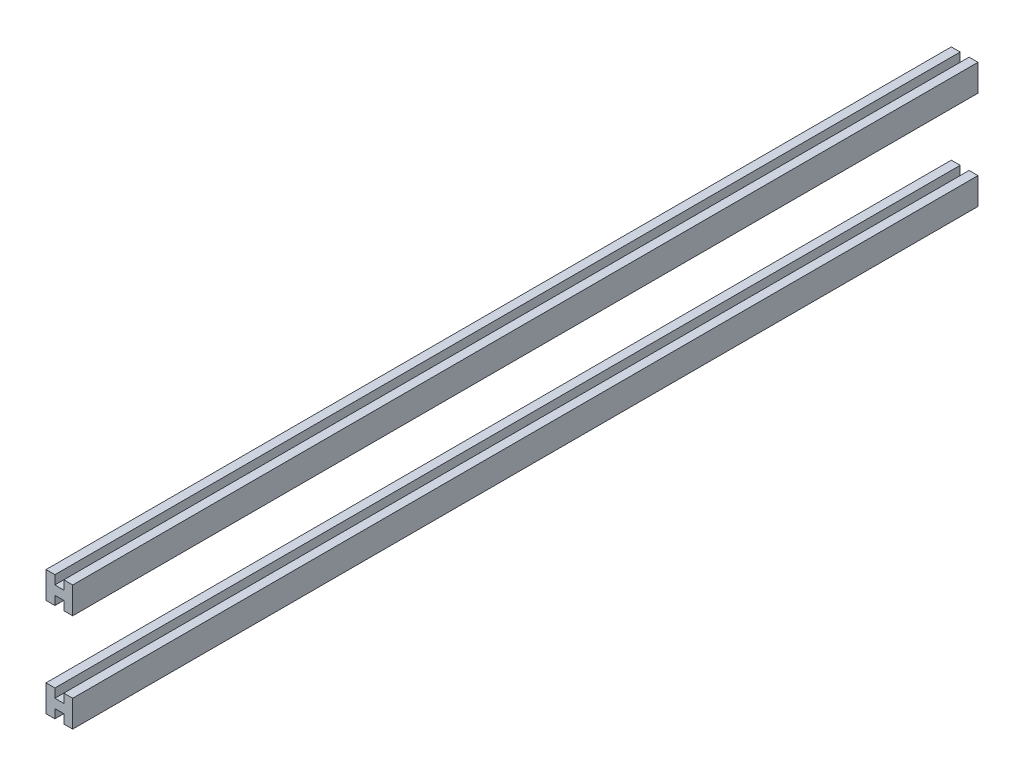
ISO-10303-21;
HEADER;
FILE_DESCRIPTION(('STEP AP214'),'2;1');
FILE_NAME('part.step','',(''),(''),'','','');
FILE_SCHEMA(('AUTOMOTIVE_DESIGN { 1 0 10303 214 1 1 1 1 }'));
ENDSEC;
DATA;
#1=APPLICATION_CONTEXT('core data for automotive mechanical design processes');
#2=APPLICATION_PROTOCOL_DEFINITION('international standard','automotive_design',2000,#1);
#3=PRODUCT_CONTEXT('',#1,'mechanical');
#4=PRODUCT('Part','Part','',(#3));
#5=PRODUCT_RELATED_PRODUCT_CATEGORY('part','',(#4));
#6=PRODUCT_DEFINITION_FORMATION('','',#4);
#7=PRODUCT_DEFINITION_CONTEXT('part definition',#1,'design');
#8=PRODUCT_DEFINITION('design','',#6,#7);
#9=PRODUCT_DEFINITION_SHAPE('','',#8);
#10=(LENGTH_UNIT() NAMED_UNIT(*) SI_UNIT(.MILLI.,.METRE.));
#11=(NAMED_UNIT(*) PLANE_ANGLE_UNIT() SI_UNIT($,.RADIAN.));
#12=(NAMED_UNIT(*) SI_UNIT($,.STERADIAN.) SOLID_ANGLE_UNIT());
#13=UNCERTAINTY_MEASURE_WITH_UNIT(LENGTH_MEASURE(1.E-05),#10,'distance_accuracy_value','');
#14=(GEOMETRIC_REPRESENTATION_CONTEXT(3) GLOBAL_UNCERTAINTY_ASSIGNED_CONTEXT((#13)) GLOBAL_UNIT_ASSIGNED_CONTEXT((#10,
#11,#12)) REPRESENTATION_CONTEXT('',''));
#15=CARTESIAN_POINT('',(0.,0.,0.));
#16=DIRECTION('',(0.,0.,1.));
#17=DIRECTION('',(1.,0.,0.));
#18=AXIS2_PLACEMENT_3D('',#15,#16,#17);
#19=CARTESIAN_POINT('',(368.783100920621,83.4055956434929,2578.1));
#20=DIRECTION('',(1.,0.,0.));
#21=DIRECTION('',(0.,1.,0.));
#22=AXIS2_PLACEMENT_3D('',#19,#20,#21);
#23=PLANE('',#22);
#24=DIRECTION('',(0.,-1.,0.));
#25=VECTOR('',#24,1.);
#26=CARTESIAN_POINT('',(368.783100920621,83.4055956434929,0.));
#27=LINE('',#26,#25);
#28=CARTESIAN_POINT('',(368.783100920621,83.4055956434929,0.));
#29=VERTEX_POINT('',#28);
#30=CARTESIAN_POINT('',(368.783100920621,58.0256924975783,0.));
#31=VERTEX_POINT('',#30);
#32=EDGE_CURVE('E12',#29,#31,#27,.T.);
#33=ORIENTED_EDGE('',*,*,#32,.F.);
#34=DIRECTION('',(0.,0.,-1.));
#35=VECTOR('',#34,1.);
#36=CARTESIAN_POINT('',(368.783100920621,83.4055956434929,2578.1));
#37=LINE('',#36,#35);
#38=CARTESIAN_POINT('',(368.783100920621,83.4055956434929,2578.1));
#39=VERTEX_POINT('',#38);
#40=EDGE_CURVE('E115',#39,#29,#37,.T.);
#41=ORIENTED_EDGE('',*,*,#40,.F.);
#42=DIRECTION('',(0.,-1.,0.));
#43=VECTOR('',#42,1.);
#44=CARTESIAN_POINT('',(368.783100920621,83.4055956434929,2578.1));
#45=LINE('',#44,#43);
#46=CARTESIAN_POINT('',(368.783100920621,58.0256924975783,2578.1));
#47=VERTEX_POINT('',#46);
#48=EDGE_CURVE('E47',#39,#47,#45,.T.);
#49=ORIENTED_EDGE('',*,*,#48,.T.);
#50=DIRECTION('',(0.,0.,-1.));
#51=VECTOR('',#50,1.);
#52=CARTESIAN_POINT('',(368.783100920621,58.0256924975783,2578.1));
#53=LINE('',#52,#51);
#54=EDGE_CURVE('E62',#47,#31,#53,.T.);
#55=ORIENTED_EDGE('',*,*,#54,.T.);
#56=EDGE_LOOP('',(#33,#41,#49,#55));
#57=FACE_BOUND('',#56,.T.);
#58=ADVANCED_FACE('F43',(#57),#23,.T.);
#59=CARTESIAN_POINT('',(368.783100920621,83.4055956434929,2578.1));
#60=DIRECTION('',(0.,-1.,0.));
#61=DIRECTION('',(1.,0.,0.));
#62=AXIS2_PLACEMENT_3D('',#59,#60,#61);
#63=PLANE('',#62);
#64=DIRECTION('',(-1.,0.,0.));
#65=VECTOR('',#64,1.);
#66=CARTESIAN_POINT('',(368.783100920621,83.4055956434929,0.));
#67=LINE('',#66,#65);
#68=CARTESIAN_POINT('',(343.471899041142,83.4055956434928,0.));
#69=VERTEX_POINT('',#68);
#70=EDGE_CURVE('E190',#29,#69,#67,.T.);
#71=ORIENTED_EDGE('',*,*,#70,.T.);
#72=DIRECTION('',(0.,0.,-1.));
#73=VECTOR('',#72,1.);
#74=CARTESIAN_POINT('',(343.471899041142,83.4055956434928,2578.1));
#75=LINE('',#74,#73);
#76=CARTESIAN_POINT('',(343.471899041142,83.4055956434928,2578.1));
#77=VERTEX_POINT('',#76);
#78=EDGE_CURVE('E247',#77,#69,#75,.T.);
#79=ORIENTED_EDGE('',*,*,#78,.F.);
#80=DIRECTION('',(-1.,0.,0.));
#81=VECTOR('',#80,1.);
#82=CARTESIAN_POINT('',(368.783100920621,83.4055956434929,2578.1));
#83=LINE('',#82,#81);
#84=EDGE_CURVE('E167',#39,#77,#83,.T.);
#85=ORIENTED_EDGE('',*,*,#84,.F.);
#86=ORIENTED_EDGE('',*,*,#40,.T.);
#87=EDGE_LOOP('',(#71,#79,#85,#86));
#88=FACE_BOUND('',#87,.T.);
#89=ADVANCED_FACE('F256',(#88),#63,.F.);
#90=CARTESIAN_POINT('',(343.471899041142,83.4055956434928,2578.1));
#91=DIRECTION('',(1.,0.,0.));
#92=DIRECTION('',(0.,1.,0.));
#93=AXIS2_PLACEMENT_3D('',#90,#91,#92);
#94=PLANE('',#93);
#95=DIRECTION('',(0.,-1.,0.));
#96=VECTOR('',#95,1.);
#97=CARTESIAN_POINT('',(343.471899041142,83.4055956434928,0.));
#98=LINE('',#97,#96);
#99=CARTESIAN_POINT('',(343.471899041142,7.20559564349288,0.));
#100=VERTEX_POINT('',#99);
#101=EDGE_CURVE('E191',#69,#100,#98,.T.);
#102=ORIENTED_EDGE('',*,*,#101,.T.);
#103=DIRECTION('',(0.,0.,-1.));
#104=VECTOR('',#103,1.);
#105=CARTESIAN_POINT('',(343.471899041142,7.20559564349288,2578.1));
#106=LINE('',#105,#104);
#107=CARTESIAN_POINT('',(343.471899041142,7.20559564349288,2578.1));
#108=VERTEX_POINT('',#107);
#109=EDGE_CURVE('E245',#108,#100,#106,.T.);
#110=ORIENTED_EDGE('',*,*,#109,.F.);
#111=DIRECTION('',(0.,-1.,0.));
#112=VECTOR('',#111,1.);
#113=CARTESIAN_POINT('',(343.471899041142,83.4055956434928,2578.1));
#114=LINE('',#113,#112);
#115=EDGE_CURVE('E169',#77,#108,#114,.T.);
#116=ORIENTED_EDGE('',*,*,#115,.F.);
#117=ORIENTED_EDGE('',*,*,#78,.T.);
#118=EDGE_LOOP('',(#102,#110,#116,#117));
#119=FACE_BOUND('',#118,.T.);
#120=ADVANCED_FACE('F253',(#119),#94,.F.);
#121=CARTESIAN_POINT('',(368.783100920621,7.20559564349288,2578.1));
#122=DIRECTION('',(0.,-1.,0.));
#123=DIRECTION('',(0.,0.,-1.));
#124=AXIS2_PLACEMENT_3D('',#121,#122,#123);
#125=PLANE('',#124);
#126=DIRECTION('',(-1.,0.,0.));
#127=VECTOR('',#126,1.);
#128=CARTESIAN_POINT('',(368.783100920621,7.20559564349288,0.));
#129=LINE('',#128,#127);
#130=CARTESIAN_POINT('',(368.783100920621,7.20559564349288,0.));
#131=VERTEX_POINT('',#130);
#132=EDGE_CURVE('E196',#131,#100,#129,.T.);
#133=ORIENTED_EDGE('',*,*,#132,.F.);
#134=DIRECTION('',(0.,0.,-1.));
#135=VECTOR('',#134,1.);
#136=CARTESIAN_POINT('',(368.783100920621,7.20559564349288,2578.1));
#137=LINE('',#136,#135);
#138=CARTESIAN_POINT('',(368.783100920621,7.20559564349288,2578.1));
#139=VERTEX_POINT('',#138);
#140=EDGE_CURVE('E240',#139,#131,#137,.T.);
#141=ORIENTED_EDGE('',*,*,#140,.F.);
#142=DIRECTION('',(-1.,0.,0.));
#143=VECTOR('',#142,1.);
#144=CARTESIAN_POINT('',(368.783100920621,7.20559564349288,2578.1));
#145=LINE('',#144,#143);
#146=EDGE_CURVE('E171',#139,#108,#145,.T.);
#147=ORIENTED_EDGE('',*,*,#146,.T.);
#148=ORIENTED_EDGE('',*,*,#109,.T.);
#149=EDGE_LOOP('',(#133,#141,#147,#148));
#150=FACE_BOUND('',#149,.T.);
#151=ADVANCED_FACE('F255',(#150),#125,.T.);
#152=CARTESIAN_POINT('',(368.783100920621,7.20559564349288,2578.1));
#153=DIRECTION('',(-1.,0.,0.));
#154=DIRECTION('',(0.,0.,1.));
#155=AXIS2_PLACEMENT_3D('',#152,#153,#154);
#156=PLANE('',#155);
#157=DIRECTION('',(0.,1.,0.));
#158=VECTOR('',#157,1.);
#159=CARTESIAN_POINT('',(368.783100920621,7.20559564349288,0.));
#160=LINE('',#159,#158);
#161=CARTESIAN_POINT('',(368.783100920621,32.5854987894074,0.));
#162=VERTEX_POINT('',#161);
#163=EDGE_CURVE('E203',#131,#162,#160,.T.);
#164=ORIENTED_EDGE('',*,*,#163,.T.);
#165=DIRECTION('',(0.,0.,-1.));
#166=VECTOR('',#165,1.);
#167=CARTESIAN_POINT('',(368.783100920621,32.5854987894074,2578.1));
#168=LINE('',#167,#166);
#169=CARTESIAN_POINT('',(368.783100920621,32.5854987894074,2578.1));
#170=VERTEX_POINT('',#169);
#171=EDGE_CURVE('E237',#170,#162,#168,.T.);
#172=ORIENTED_EDGE('',*,*,#171,.F.);
#173=DIRECTION('',(0.,1.,0.));
#174=VECTOR('',#173,1.);
#175=CARTESIAN_POINT('',(368.783100920621,7.20559564349288,2578.1));
#176=LINE('',#175,#174);
#177=EDGE_CURVE('E174',#139,#170,#176,.T.);
#178=ORIENTED_EDGE('',*,*,#177,.F.);
#179=ORIENTED_EDGE('',*,*,#140,.T.);
#180=EDGE_LOOP('',(#164,#172,#178,#179));
#181=FACE_BOUND('',#180,.T.);
#182=ADVANCED_FACE('F242',(#181),#156,.F.);
#183=CARTESIAN_POINT('',(394.183100920621,32.5854987894074,2578.1));
#184=DIRECTION('',(0.,-1.,0.));
#185=DIRECTION('',(0.,0.,-1.));
#186=AXIS2_PLACEMENT_3D('',#183,#184,#185);
#187=PLANE('',#186);
#188=DIRECTION('',(-1.,0.,0.));
#189=VECTOR('',#188,1.);
#190=CARTESIAN_POINT('',(394.183100920621,32.5854987894074,0.));
#191=LINE('',#190,#189);
#192=CARTESIAN_POINT('',(394.183100920621,32.5854987894074,0.));
#193=VERTEX_POINT('',#192);
#194=EDGE_CURVE('E206',#193,#162,#191,.T.);
#195=ORIENTED_EDGE('',*,*,#194,.F.);
#196=DIRECTION('',(0.,0.,-1.));
#197=VECTOR('',#196,1.);
#198=CARTESIAN_POINT('',(394.183100920621,32.5854987894074,2578.1));
#199=LINE('',#198,#197);
#200=CARTESIAN_POINT('',(394.183100920621,32.5854987894074,2578.1));
#201=VERTEX_POINT('',#200);
#202=EDGE_CURVE('E227',#201,#193,#199,.T.);
#203=ORIENTED_EDGE('',*,*,#202,.F.);
#204=DIRECTION('',(-1.,0.,0.));
#205=VECTOR('',#204,1.);
#206=CARTESIAN_POINT('',(394.183100920621,32.5854987894074,2578.1));
#207=LINE('',#206,#205);
#208=EDGE_CURVE('E176',#201,#170,#207,.T.);
#209=ORIENTED_EDGE('',*,*,#208,.T.);
#210=ORIENTED_EDGE('',*,*,#171,.T.);
#211=EDGE_LOOP('',(#195,#203,#209,#210));
#212=FACE_BOUND('',#211,.T.);
#213=ADVANCED_FACE('F234',(#212),#187,.T.);
#214=CARTESIAN_POINT('',(394.183100920621,7.20559564349288,2578.1));
#215=DIRECTION('',(-1.,0.,0.));
#216=DIRECTION('',(0.,0.,1.));
#217=AXIS2_PLACEMENT_3D('',#214,#215,#216);
#218=PLANE('',#217);
#219=DIRECTION('',(0.,1.,0.));
#220=VECTOR('',#219,1.);
#221=CARTESIAN_POINT('',(394.183100920621,7.20559564349288,0.));
#222=LINE('',#221,#220);
#223=CARTESIAN_POINT('',(394.183100920621,7.20559564349288,0.));
#224=VERTEX_POINT('',#223);
#225=EDGE_CURVE('E209',#224,#193,#222,.T.);
#226=ORIENTED_EDGE('',*,*,#225,.F.);
#227=DIRECTION('',(0.,0.,-1.));
#228=VECTOR('',#227,1.);
#229=CARTESIAN_POINT('',(394.183100920621,7.20559564349288,2578.1));
#230=LINE('',#229,#228);
#231=CARTESIAN_POINT('',(394.183100920621,7.20559564349288,2578.1));
#232=VERTEX_POINT('',#231);
#233=EDGE_CURVE('E221',#232,#224,#230,.T.);
#234=ORIENTED_EDGE('',*,*,#233,.F.);
#235=DIRECTION('',(0.,1.,0.));
#236=VECTOR('',#235,1.);
#237=CARTESIAN_POINT('',(394.183100920621,7.20559564349288,2578.1));
#238=LINE('',#237,#236);
#239=EDGE_CURVE('E179',#232,#201,#238,.T.);
#240=ORIENTED_EDGE('',*,*,#239,.T.);
#241=ORIENTED_EDGE('',*,*,#202,.T.);
#242=EDGE_LOOP('',(#226,#234,#240,#241));
#243=FACE_BOUND('',#242,.T.);
#244=ADVANCED_FACE('F229',(#243),#218,.T.);
#245=CARTESIAN_POINT('',(419.4943028001,7.20559564349288,2578.1));
#246=DIRECTION('',(0.,-1.,0.));
#247=DIRECTION('',(0.,0.,-1.));
#248=AXIS2_PLACEMENT_3D('',#245,#246,#247);
#249=PLANE('',#248);
#250=DIRECTION('',(-1.,0.,0.));
#251=VECTOR('',#250,1.);
#252=CARTESIAN_POINT('',(419.4943028001,7.20559564349288,0.));
#253=LINE('',#252,#251);
#254=CARTESIAN_POINT('',(419.4943028001,7.20559564349288,0.));
#255=VERTEX_POINT('',#254);
#256=EDGE_CURVE('E212',#255,#224,#253,.T.);
#257=ORIENTED_EDGE('',*,*,#256,.F.);
#258=DIRECTION('',(0.,0.,-1.));
#259=VECTOR('',#258,1.);
#260=CARTESIAN_POINT('',(419.4943028001,7.20559564349288,2578.1));
#261=LINE('',#260,#259);
#262=CARTESIAN_POINT('',(419.4943028001,7.20559564349288,2578.1));
#263=VERTEX_POINT('',#262);
#264=EDGE_CURVE('E217',#263,#255,#261,.T.);
#265=ORIENTED_EDGE('',*,*,#264,.F.);
#266=DIRECTION('',(-1.,0.,0.));
#267=VECTOR('',#266,1.);
#268=CARTESIAN_POINT('',(419.4943028001,7.20559564349288,2578.1));
#269=LINE('',#268,#267);
#270=EDGE_CURVE('E182',#263,#232,#269,.T.);
#271=ORIENTED_EDGE('',*,*,#270,.T.);
#272=ORIENTED_EDGE('',*,*,#233,.T.);
#273=EDGE_LOOP('',(#257,#265,#271,#272));
#274=FACE_BOUND('',#273,.T.);
#275=ADVANCED_FACE('F223',(#274),#249,.T.);
#276=CARTESIAN_POINT('',(419.4943028001,83.4055956434928,2578.1));
#277=DIRECTION('',(1.,0.,0.));
#278=DIRECTION('',(0.,0.,-1.));
#279=AXIS2_PLACEMENT_3D('',#276,#277,#278);
#280=PLANE('',#279);
#281=DIRECTION('',(0.,-1.,0.));
#282=VECTOR('',#281,1.);
#283=CARTESIAN_POINT('',(419.4943028001,83.4055956434928,0.));
#284=LINE('',#283,#282);
#285=CARTESIAN_POINT('',(419.4943028001,83.4055956434928,0.));
#286=VERTEX_POINT('',#285);
#287=EDGE_CURVE('E154',#286,#255,#284,.T.);
#288=ORIENTED_EDGE('',*,*,#287,.F.);
#289=DIRECTION('',(0.,0.,-1.));
#290=VECTOR('',#289,1.);
#291=CARTESIAN_POINT('',(419.4943028001,83.4055956434928,2578.1));
#292=LINE('',#291,#290);
#293=CARTESIAN_POINT('',(419.4943028001,83.4055956434928,2578.1));
#294=VERTEX_POINT('',#293);
#295=EDGE_CURVE('E148',#294,#286,#292,.T.);
#296=ORIENTED_EDGE('',*,*,#295,.F.);
#297=DIRECTION('',(0.,-1.,0.));
#298=VECTOR('',#297,1.);
#299=CARTESIAN_POINT('',(419.4943028001,83.4055956434928,2578.1));
#300=LINE('',#299,#298);
#301=EDGE_CURVE('E185',#294,#263,#300,.T.);
#302=ORIENTED_EDGE('',*,*,#301,.T.);
#303=ORIENTED_EDGE('',*,*,#264,.T.);
#304=EDGE_LOOP('',(#288,#296,#302,#303));
#305=FACE_BOUND('',#304,.T.);
#306=ADVANCED_FACE('F216',(#305),#280,.T.);
#307=CARTESIAN_POINT('',(419.4943028001,83.4055956434928,2578.1));
#308=DIRECTION('',(0.,-1.,0.));
#309=DIRECTION('',(0.,0.,-1.));
#310=AXIS2_PLACEMENT_3D('',#307,#308,#309);
#311=PLANE('',#310);
#312=DIRECTION('',(-1.,0.,0.));
#313=VECTOR('',#312,1.);
#314=CARTESIAN_POINT('',(419.4943028001,83.4055956434928,0.));
#315=LINE('',#314,#313);
#316=CARTESIAN_POINT('',(394.183100920621,83.4055956434928,0.));
#317=VERTEX_POINT('',#316);
#318=EDGE_CURVE('E143',#286,#317,#315,.T.);
#319=ORIENTED_EDGE('',*,*,#318,.T.);
#320=DIRECTION('',(0.,0.,-1.));
#321=VECTOR('',#320,1.);
#322=CARTESIAN_POINT('',(394.183100920621,83.4055956434928,2578.1));
#323=LINE('',#322,#321);
#324=CARTESIAN_POINT('',(394.183100920621,83.4055956434928,2578.1));
#325=VERTEX_POINT('',#324);
#326=EDGE_CURVE('E147',#325,#317,#323,.T.);
#327=ORIENTED_EDGE('',*,*,#326,.F.);
#328=DIRECTION('',(-1.,0.,0.));
#329=VECTOR('',#328,1.);
#330=CARTESIAN_POINT('',(419.4943028001,83.4055956434928,2578.1));
#331=LINE('',#330,#329);
#332=EDGE_CURVE('E188',#294,#325,#331,.T.);
#333=ORIENTED_EDGE('',*,*,#332,.F.);
#334=ORIENTED_EDGE('',*,*,#295,.T.);
#335=EDGE_LOOP('',(#319,#327,#333,#334));
#336=FACE_BOUND('',#335,.T.);
#337=ADVANCED_FACE('F145',(#336),#311,.F.);
#338=CARTESIAN_POINT('',(394.183100920621,83.4055956434928,2578.1));
#339=DIRECTION('',(1.,0.,0.));
#340=DIRECTION('',(0.,0.,-1.));
#341=AXIS2_PLACEMENT_3D('',#338,#339,#340);
#342=PLANE('',#341);
#343=DIRECTION('',(0.,-1.,0.));
#344=VECTOR('',#343,1.);
#345=CARTESIAN_POINT('',(394.183100920621,83.4055956434928,0.));
#346=LINE('',#345,#344);
#347=CARTESIAN_POINT('',(394.183100920621,58.0256924975783,0.));
#348=VERTEX_POINT('',#347);
#349=EDGE_CURVE('E153',#317,#348,#346,.T.);
#350=ORIENTED_EDGE('',*,*,#349,.T.);
#351=DIRECTION('',(0.,0.,-1.));
#352=VECTOR('',#351,1.);
#353=CARTESIAN_POINT('',(394.183100920621,58.0256924975783,2578.1));
#354=LINE('',#353,#352);
#355=CARTESIAN_POINT('',(394.183100920621,58.0256924975783,2578.1));
#356=VERTEX_POINT('',#355);
#357=EDGE_CURVE('E159',#356,#348,#354,.T.);
#358=ORIENTED_EDGE('',*,*,#357,.F.);
#359=DIRECTION('',(0.,-1.,0.));
#360=VECTOR('',#359,1.);
#361=CARTESIAN_POINT('',(394.183100920621,83.4055956434928,2578.1));
#362=LINE('',#361,#360);
#363=EDGE_CURVE('E103',#325,#356,#362,.T.);
#364=ORIENTED_EDGE('',*,*,#363,.F.);
#365=ORIENTED_EDGE('',*,*,#326,.T.);
#366=EDGE_LOOP('',(#350,#358,#364,#365));
#367=FACE_BOUND('',#366,.T.);
#368=ADVANCED_FACE('F157',(#367),#342,.F.);
#369=CARTESIAN_POINT('',(394.183100920621,58.0256924975783,2578.1));
#370=DIRECTION('',(0.,-1.,0.));
#371=DIRECTION('',(1.,0.,0.));
#372=AXIS2_PLACEMENT_3D('',#369,#370,#371);
#373=PLANE('',#372);
#374=DIRECTION('',(-1.,0.,0.));
#375=VECTOR('',#374,1.);
#376=CARTESIAN_POINT('',(394.183100920621,58.0256924975783,0.));
#377=LINE('',#376,#375);
#378=EDGE_CURVE('E53',#348,#31,#377,.T.);
#379=ORIENTED_EDGE('',*,*,#378,.T.);
#380=ORIENTED_EDGE('',*,*,#54,.F.);
#381=DIRECTION('',(-1.,0.,0.));
#382=VECTOR('',#381,1.);
#383=CARTESIAN_POINT('',(394.183100920621,58.0256924975783,2578.1));
#384=LINE('',#383,#382);
#385=EDGE_CURVE('E108',#356,#47,#384,.T.);
#386=ORIENTED_EDGE('',*,*,#385,.F.);
#387=ORIENTED_EDGE('',*,*,#357,.T.);
#388=EDGE_LOOP('',(#379,#380,#386,#387));
#389=FACE_BOUND('',#388,.T.);
#390=ADVANCED_FACE('F270',(#389),#373,.F.);
#391=CARTESIAN_POINT('',(0.,0.,2578.1));
#392=DIRECTION('',(0.,0.,-1.));
#393=DIRECTION('',(-1.,0.,0.));
#394=AXIS2_PLACEMENT_3D('',#391,#392,#393);
#395=PLANE('',#394);
#396=ORIENTED_EDGE('',*,*,#48,.F.);
#397=ORIENTED_EDGE('',*,*,#84,.T.);
#398=ORIENTED_EDGE('',*,*,#115,.T.);
#399=ORIENTED_EDGE('',*,*,#146,.F.);
#400=ORIENTED_EDGE('',*,*,#177,.T.);
#401=ORIENTED_EDGE('',*,*,#208,.F.);
#402=ORIENTED_EDGE('',*,*,#239,.F.);
#403=ORIENTED_EDGE('',*,*,#270,.F.);
#404=ORIENTED_EDGE('',*,*,#301,.F.);
#405=ORIENTED_EDGE('',*,*,#332,.T.);
#406=ORIENTED_EDGE('',*,*,#363,.T.);
#407=ORIENTED_EDGE('',*,*,#385,.T.);
#408=EDGE_LOOP('',(#396,#397,#398,#399,#400,#401,#402,#403,#404,#405,#406,#407));
#409=FACE_BOUND('',#408,.T.);
#410=ADVANCED_FACE('F45',(#409),#395,.F.);
#411=CARTESIAN_POINT('',(0.,0.,0.));
#412=DIRECTION('',(0.,0.,-1.));
#413=DIRECTION('',(-1.,0.,0.));
#414=AXIS2_PLACEMENT_3D('',#411,#412,#413);
#415=PLANE('',#414);
#416=ORIENTED_EDGE('',*,*,#32,.T.);
#417=ORIENTED_EDGE('',*,*,#378,.F.);
#418=ORIENTED_EDGE('',*,*,#349,.F.);
#419=ORIENTED_EDGE('',*,*,#318,.F.);
#420=ORIENTED_EDGE('',*,*,#287,.T.);
#421=ORIENTED_EDGE('',*,*,#256,.T.);
#422=ORIENTED_EDGE('',*,*,#225,.T.);
#423=ORIENTED_EDGE('',*,*,#194,.T.);
#424=ORIENTED_EDGE('',*,*,#163,.F.);
#425=ORIENTED_EDGE('',*,*,#132,.T.);
#426=ORIENTED_EDGE('',*,*,#101,.F.);
#427=ORIENTED_EDGE('',*,*,#70,.F.);
#428=EDGE_LOOP('',(#416,#417,#418,#419,#420,#421,#422,#423,#424,#425,#426,#427));
#429=FACE_BOUND('',#428,.T.);
#430=ADVANCED_FACE('F162',(#429),#415,.T.);
#431=CLOSED_SHELL('',(#58,#89,#120,#151,#182,#213,#244,#275,#306,#337,#368,#390,#410,#430));
#432=MANIFOLD_SOLID_BREP('B2',#431);
#433=CARTESIAN_POINT('',(368.783100920621,-272.194404356507,2578.1));
#434=DIRECTION('',(0.,-1.,0.));
#435=DIRECTION('',(1.,0.,0.));
#436=AXIS2_PLACEMENT_3D('',#433,#434,#435);
#437=PLANE('',#436);
#438=DIRECTION('',(-1.,0.,0.));
#439=VECTOR('',#438,1.);
#440=CARTESIAN_POINT('',(368.783100920621,-272.194404356507,0.));
#441=LINE('',#440,#439);
#442=CARTESIAN_POINT('',(368.783100920621,-272.194404356507,0.));
#443=VERTEX_POINT('',#442);
#444=CARTESIAN_POINT('',(343.471899041142,-272.194404356507,0.));
#445=VERTEX_POINT('',#444);
#446=EDGE_CURVE('E497',#443,#445,#441,.T.);
#447=ORIENTED_EDGE('',*,*,#446,.F.);
#448=DIRECTION('',(0.,0.,-1.));
#449=VECTOR('',#448,1.);
#450=CARTESIAN_POINT('',(368.783100920621,-272.194404356507,2578.1));
#451=LINE('',#450,#449);
#452=CARTESIAN_POINT('',(368.783100920621,-272.194404356507,2578.1));
#453=VERTEX_POINT('',#452);
#454=EDGE_CURVE('E41',#453,#443,#451,.T.);
#455=ORIENTED_EDGE('',*,*,#454,.F.);
#456=DIRECTION('',(-1.,0.,0.));
#457=VECTOR('',#456,1.);
#458=CARTESIAN_POINT('',(368.783100920621,-272.194404356507,2578.1));
#459=LINE('',#458,#457);
#460=CARTESIAN_POINT('',(343.471899041142,-272.194404356507,2578.1));
#461=VERTEX_POINT('',#460);
#462=EDGE_CURVE('E525',#453,#461,#459,.T.);
#463=ORIENTED_EDGE('',*,*,#462,.T.);
#464=DIRECTION('',(0.,0.,-1.));
#465=VECTOR('',#464,1.);
#466=CARTESIAN_POINT('',(343.471899041142,-272.194404356507,2578.1));
#467=LINE('',#466,#465);
#468=EDGE_CURVE('E378',#461,#445,#467,.T.);
#469=ORIENTED_EDGE('',*,*,#468,.T.);
#470=EDGE_LOOP('',(#447,#455,#463,#469));
#471=FACE_BOUND('',#470,.T.);
#472=ADVANCED_FACE('F375',(#471),#437,.T.);
#473=CARTESIAN_POINT('',(368.783100920621,-272.194404356507,2578.1));
#474=DIRECTION('',(-1.,0.,0.));
#475=DIRECTION('',(0.,-1.,0.));
#476=AXIS2_PLACEMENT_3D('',#473,#474,#475);
#477=PLANE('',#476);
#478=DIRECTION('',(0.,1.,0.));
#479=VECTOR('',#478,1.);
#480=CARTESIAN_POINT('',(368.783100920621,-272.194404356507,0.));
#481=LINE('',#480,#479);
#482=CARTESIAN_POINT('',(368.783100920621,-246.814501210593,0.));
#483=VERTEX_POINT('',#482);
#484=EDGE_CURVE('E524',#443,#483,#481,.T.);
#485=ORIENTED_EDGE('',*,*,#484,.T.);
#486=DIRECTION('',(0.,0.,-1.));
#487=VECTOR('',#486,1.);
#488=CARTESIAN_POINT('',(368.783100920621,-246.814501210593,2578.1));
#489=LINE('',#488,#487);
#490=CARTESIAN_POINT('',(368.783100920621,-246.814501210593,2578.1));
#491=VERTEX_POINT('',#490);
#492=EDGE_CURVE('E384',#491,#483,#489,.T.);
#493=ORIENTED_EDGE('',*,*,#492,.F.);
#494=DIRECTION('',(0.,1.,0.));
#495=VECTOR('',#494,1.);
#496=CARTESIAN_POINT('',(368.783100920621,-272.194404356507,2578.1));
#497=LINE('',#496,#495);
#498=EDGE_CURVE('E487',#453,#491,#497,.T.);
#499=ORIENTED_EDGE('',*,*,#498,.F.);
#500=ORIENTED_EDGE('',*,*,#454,.T.);
#501=EDGE_LOOP('',(#485,#493,#499,#500));
#502=FACE_BOUND('',#501,.T.);
#503=ADVANCED_FACE('F549',(#502),#477,.F.);
#504=CARTESIAN_POINT('',(394.183100920621,-246.814501210593,2578.1));
#505=DIRECTION('',(0.,-1.,0.));
#506=DIRECTION('',(1.,0.,0.));
#507=AXIS2_PLACEMENT_3D('',#504,#505,#506);
#508=PLANE('',#507);
#509=DIRECTION('',(-1.,0.,0.));
#510=VECTOR('',#509,1.);
#511=CARTESIAN_POINT('',(394.183100920621,-246.814501210593,0.));
#512=LINE('',#511,#510);
#513=CARTESIAN_POINT('',(394.183100920621,-246.814501210593,0.));
#514=VERTEX_POINT('',#513);
#515=EDGE_CURVE('E473',#514,#483,#512,.T.);
#516=ORIENTED_EDGE('',*,*,#515,.F.);
#517=DIRECTION('',(0.,0.,-1.));
#518=VECTOR('',#517,1.);
#519=CARTESIAN_POINT('',(394.183100920621,-246.814501210593,2578.1));
#520=LINE('',#519,#518);
#521=CARTESIAN_POINT('',(394.183100920621,-246.814501210593,2578.1));
#522=VERTEX_POINT('',#521);
#523=EDGE_CURVE('E468',#522,#514,#520,.T.);
#524=ORIENTED_EDGE('',*,*,#523,.F.);
#525=DIRECTION('',(-1.,0.,0.));
#526=VECTOR('',#525,1.);
#527=CARTESIAN_POINT('',(394.183100920621,-246.814501210593,2578.1));
#528=LINE('',#527,#526);
#529=EDGE_CURVE('E471',#522,#491,#528,.T.);
#530=ORIENTED_EDGE('',*,*,#529,.T.);
#531=ORIENTED_EDGE('',*,*,#492,.T.);
#532=EDGE_LOOP('',(#516,#524,#530,#531));
#533=FACE_BOUND('',#532,.T.);
#534=ADVANCED_FACE('F470',(#533),#508,.T.);
#535=CARTESIAN_POINT('',(394.183100920621,-272.194404356507,2578.1));
#536=DIRECTION('',(-1.,0.,0.));
#537=DIRECTION('',(0.,0.,1.));
#538=AXIS2_PLACEMENT_3D('',#535,#536,#537);
#539=PLANE('',#538);
#540=DIRECTION('',(0.,1.,0.));
#541=VECTOR('',#540,1.);
#542=CARTESIAN_POINT('',(394.183100920621,-272.194404356507,0.));
#543=LINE('',#542,#541);
#544=CARTESIAN_POINT('',(394.183100920621,-272.194404356507,0.));
#545=VERTEX_POINT('',#544);
#546=EDGE_CURVE('E521',#545,#514,#543,.T.);
#547=ORIENTED_EDGE('',*,*,#546,.F.);
#548=DIRECTION('',(0.,0.,-1.));
#549=VECTOR('',#548,1.);
#550=CARTESIAN_POINT('',(394.183100920621,-272.194404356507,2578.1));
#551=LINE('',#550,#549);
#552=CARTESIAN_POINT('',(394.183100920621,-272.194404356507,2578.1));
#553=VERTEX_POINT('',#552);
#554=EDGE_CURVE('E478',#553,#545,#551,.T.);
#555=ORIENTED_EDGE('',*,*,#554,.F.);
#556=DIRECTION('',(0.,1.,0.));
#557=VECTOR('',#556,1.);
#558=CARTESIAN_POINT('',(394.183100920621,-272.194404356507,2578.1));
#559=LINE('',#558,#557);
#560=EDGE_CURVE('E485',#553,#522,#559,.T.);
#561=ORIENTED_EDGE('',*,*,#560,.T.);
#562=ORIENTED_EDGE('',*,*,#523,.T.);
#563=EDGE_LOOP('',(#547,#555,#561,#562));
#564=FACE_BOUND('',#563,.T.);
#565=ADVANCED_FACE('F489',(#564),#539,.T.);
#566=CARTESIAN_POINT('',(419.4943028001,-272.194404356507,2578.1));
#567=DIRECTION('',(0.,-1.,0.));
#568=DIRECTION('',(0.,0.,-1.));
#569=AXIS2_PLACEMENT_3D('',#566,#567,#568);
#570=PLANE('',#569);
#571=DIRECTION('',(-1.,0.,0.));
#572=VECTOR('',#571,1.);
#573=CARTESIAN_POINT('',(419.4943028001,-272.194404356507,0.));
#574=LINE('',#573,#572);
#575=CARTESIAN_POINT('',(419.4943028001,-272.194404356507,0.));
#576=VERTEX_POINT('',#575);
#577=EDGE_CURVE('E518',#576,#545,#574,.T.);
#578=ORIENTED_EDGE('',*,*,#577,.F.);
#579=DIRECTION('',(0.,0.,-1.));
#580=VECTOR('',#579,1.);
#581=CARTESIAN_POINT('',(419.4943028001,-272.194404356507,2578.1));
#582=LINE('',#581,#580);
#583=CARTESIAN_POINT('',(419.4943028001,-272.194404356507,2578.1));
#584=VERTEX_POINT('',#583);
#585=EDGE_CURVE('E529',#584,#576,#582,.T.);
#586=ORIENTED_EDGE('',*,*,#585,.F.);
#587=DIRECTION('',(-1.,0.,0.));
#588=VECTOR('',#587,1.);
#589=CARTESIAN_POINT('',(419.4943028001,-272.194404356507,2578.1));
#590=LINE('',#589,#588);
#591=EDGE_CURVE('E490',#584,#553,#590,.T.);
#592=ORIENTED_EDGE('',*,*,#591,.T.);
#593=ORIENTED_EDGE('',*,*,#554,.T.);
#594=EDGE_LOOP('',(#578,#586,#592,#593));
#595=FACE_BOUND('',#594,.T.);
#596=ADVANCED_FACE('F593',(#595),#570,.T.);
#597=CARTESIAN_POINT('',(419.4943028001,-272.194404356507,2578.1));
#598=DIRECTION('',(-1.,0.,0.));
#599=DIRECTION('',(0.,0.,1.));
#600=AXIS2_PLACEMENT_3D('',#597,#598,#599);
#601=PLANE('',#600);
#602=DIRECTION('',(0.,1.,0.));
#603=VECTOR('',#602,1.);
#604=CARTESIAN_POINT('',(419.4943028001,-272.194404356507,0.));
#605=LINE('',#604,#603);
#606=CARTESIAN_POINT('',(419.4943028001,-195.994404356507,0.));
#607=VERTEX_POINT('',#606);
#608=EDGE_CURVE('E516',#576,#607,#605,.T.);
#609=ORIENTED_EDGE('',*,*,#608,.T.);
#610=DIRECTION('',(0.,0.,-1.));
#611=VECTOR('',#610,1.);
#612=CARTESIAN_POINT('',(419.4943028001,-195.994404356507,2578.1));
#613=LINE('',#612,#611);
#614=CARTESIAN_POINT('',(419.4943028001,-195.994404356507,2578.1));
#615=VERTEX_POINT('',#614);
#616=EDGE_CURVE('E531',#615,#607,#613,.T.);
#617=ORIENTED_EDGE('',*,*,#616,.F.);
#618=DIRECTION('',(0.,1.,0.));
#619=VECTOR('',#618,1.);
#620=CARTESIAN_POINT('',(419.4943028001,-272.194404356507,2578.1));
#621=LINE('',#620,#619);
#622=EDGE_CURVE('E492',#584,#615,#621,.T.);
#623=ORIENTED_EDGE('',*,*,#622,.F.);
#624=ORIENTED_EDGE('',*,*,#585,.T.);
#625=EDGE_LOOP('',(#609,#617,#623,#624));
#626=FACE_BOUND('',#625,.T.);
#627=ADVANCED_FACE('F569',(#626),#601,.F.);
#628=CARTESIAN_POINT('',(419.4943028001,-195.994404356507,2578.1));
#629=DIRECTION('',(0.,-1.,0.));
#630=DIRECTION('',(0.,0.,-1.));
#631=AXIS2_PLACEMENT_3D('',#628,#629,#630);
#632=PLANE('',#631);
#633=DIRECTION('',(-1.,0.,0.));
#634=VECTOR('',#633,1.);
#635=CARTESIAN_POINT('',(419.4943028001,-195.994404356507,0.));
#636=LINE('',#635,#634);
#637=CARTESIAN_POINT('',(394.183100920621,-195.994404356507,0.));
#638=VERTEX_POINT('',#637);
#639=EDGE_CURVE('E514',#607,#638,#636,.T.);
#640=ORIENTED_EDGE('',*,*,#639,.T.);
#641=DIRECTION('',(0.,0.,-1.));
#642=VECTOR('',#641,1.);
#643=CARTESIAN_POINT('',(394.183100920621,-195.994404356507,2578.1));
#644=LINE('',#643,#642);
#645=CARTESIAN_POINT('',(394.183100920621,-195.994404356507,2578.1));
#646=VERTEX_POINT('',#645);
#647=EDGE_CURVE('E534',#646,#638,#644,.T.);
#648=ORIENTED_EDGE('',*,*,#647,.F.);
#649=DIRECTION('',(-1.,0.,0.));
#650=VECTOR('',#649,1.);
#651=CARTESIAN_POINT('',(419.4943028001,-195.994404356507,2578.1));
#652=LINE('',#651,#650);
#653=EDGE_CURVE('E563',#615,#646,#652,.T.);
#654=ORIENTED_EDGE('',*,*,#653,.F.);
#655=ORIENTED_EDGE('',*,*,#616,.T.);
#656=EDGE_LOOP('',(#640,#648,#654,#655));
#657=FACE_BOUND('',#656,.T.);
#658=ADVANCED_FACE('F573',(#657),#632,.F.);
#659=CARTESIAN_POINT('',(394.183100920621,-195.994404356507,2578.1));
#660=DIRECTION('',(1.,0.,0.));
#661=DIRECTION('',(0.,0.,-1.));
#662=AXIS2_PLACEMENT_3D('',#659,#660,#661);
#663=PLANE('',#662);
#664=DIRECTION('',(0.,-1.,0.));
#665=VECTOR('',#664,1.);
#666=CARTESIAN_POINT('',(394.183100920621,-195.994404356507,0.));
#667=LINE('',#666,#665);
#668=CARTESIAN_POINT('',(394.183100920621,-221.374307502422,0.));
#669=VERTEX_POINT('',#668);
#670=EDGE_CURVE('E512',#638,#669,#667,.T.);
#671=ORIENTED_EDGE('',*,*,#670,.T.);
#672=DIRECTION('',(0.,0.,-1.));
#673=VECTOR('',#672,1.);
#674=CARTESIAN_POINT('',(394.183100920621,-221.374307502422,2578.1));
#675=LINE('',#674,#673);
#676=CARTESIAN_POINT('',(394.183100920621,-221.374307502422,2578.1));
#677=VERTEX_POINT('',#676);
#678=EDGE_CURVE('E537',#677,#669,#675,.T.);
#679=ORIENTED_EDGE('',*,*,#678,.F.);
#680=DIRECTION('',(0.,-1.,0.));
#681=VECTOR('',#680,1.);
#682=CARTESIAN_POINT('',(394.183100920621,-195.994404356507,2578.1));
#683=LINE('',#682,#681);
#684=EDGE_CURVE('E561',#646,#677,#683,.T.);
#685=ORIENTED_EDGE('',*,*,#684,.F.);
#686=ORIENTED_EDGE('',*,*,#647,.T.);
#687=EDGE_LOOP('',(#671,#679,#685,#686));
#688=FACE_BOUND('',#687,.T.);
#689=ADVANCED_FACE('F578',(#688),#663,.F.);
#690=CARTESIAN_POINT('',(394.183100920621,-221.374307502422,2578.1));
#691=DIRECTION('',(0.,-1.,0.));
#692=DIRECTION('',(0.,0.,-1.));
#693=AXIS2_PLACEMENT_3D('',#690,#691,#692);
#694=PLANE('',#693);
#695=DIRECTION('',(-1.,0.,0.));
#696=VECTOR('',#695,1.);
#697=CARTESIAN_POINT('',(394.183100920621,-221.374307502422,0.));
#698=LINE('',#697,#696);
#699=CARTESIAN_POINT('',(368.783100920621,-221.374307502422,0.));
#700=VERTEX_POINT('',#699);
#701=EDGE_CURVE('E509',#669,#700,#698,.T.);
#702=ORIENTED_EDGE('',*,*,#701,.T.);
#703=DIRECTION('',(0.,0.,-1.));
#704=VECTOR('',#703,1.);
#705=CARTESIAN_POINT('',(368.783100920621,-221.374307502422,2578.1));
#706=LINE('',#705,#704);
#707=CARTESIAN_POINT('',(368.783100920621,-221.374307502422,2578.1));
#708=VERTEX_POINT('',#707);
#709=EDGE_CURVE('E540',#708,#700,#706,.T.);
#710=ORIENTED_EDGE('',*,*,#709,.F.);
#711=DIRECTION('',(-1.,0.,0.));
#712=VECTOR('',#711,1.);
#713=CARTESIAN_POINT('',(394.183100920621,-221.374307502422,2578.1));
#714=LINE('',#713,#712);
#715=EDGE_CURVE('E559',#677,#708,#714,.T.);
#716=ORIENTED_EDGE('',*,*,#715,.F.);
#717=ORIENTED_EDGE('',*,*,#678,.T.);
#718=EDGE_LOOP('',(#702,#710,#716,#717));
#719=FACE_BOUND('',#718,.T.);
#720=ADVANCED_FACE('F583',(#719),#694,.F.);
#721=CARTESIAN_POINT('',(368.783100920621,-195.994404356507,2578.1));
#722=DIRECTION('',(1.,0.,0.));
#723=DIRECTION('',(0.,0.,-1.));
#724=AXIS2_PLACEMENT_3D('',#721,#722,#723);
#725=PLANE('',#724);
#726=DIRECTION('',(0.,-1.,0.));
#727=VECTOR('',#726,1.);
#728=CARTESIAN_POINT('',(368.783100920621,-195.994404356507,0.));
#729=LINE('',#728,#727);
#730=CARTESIAN_POINT('',(368.783100920621,-195.994404356507,0.));
#731=VERTEX_POINT('',#730);
#732=EDGE_CURVE('E506',#731,#700,#729,.T.);
#733=ORIENTED_EDGE('',*,*,#732,.F.);
#734=DIRECTION('',(0.,0.,-1.));
#735=VECTOR('',#734,1.);
#736=CARTESIAN_POINT('',(368.783100920621,-195.994404356507,2578.1));
#737=LINE('',#736,#735);
#738=CARTESIAN_POINT('',(368.783100920621,-195.994404356507,2578.1));
#739=VERTEX_POINT('',#738);
#740=EDGE_CURVE('E542',#739,#731,#737,.T.);
#741=ORIENTED_EDGE('',*,*,#740,.F.);
#742=DIRECTION('',(0.,-1.,0.));
#743=VECTOR('',#742,1.);
#744=CARTESIAN_POINT('',(368.783100920621,-195.994404356507,2578.1));
#745=LINE('',#744,#743);
#746=EDGE_CURVE('E556',#739,#708,#745,.T.);
#747=ORIENTED_EDGE('',*,*,#746,.T.);
#748=ORIENTED_EDGE('',*,*,#709,.T.);
#749=EDGE_LOOP('',(#733,#741,#747,#748));
#750=FACE_BOUND('',#749,.T.);
#751=ADVANCED_FACE('F587',(#750),#725,.T.);
#752=CARTESIAN_POINT('',(368.783100920621,-195.994404356507,2578.1));
#753=DIRECTION('',(0.,-1.,0.));
#754=DIRECTION('',(0.,0.,-1.));
#755=AXIS2_PLACEMENT_3D('',#752,#753,#754);
#756=PLANE('',#755);
#757=DIRECTION('',(-1.,0.,0.));
#758=VECTOR('',#757,1.);
#759=CARTESIAN_POINT('',(368.783100920621,-195.994404356507,0.));
#760=LINE('',#759,#758);
#761=CARTESIAN_POINT('',(343.471899041142,-195.994404356507,0.));
#762=VERTEX_POINT('',#761);
#763=EDGE_CURVE('E503',#731,#762,#760,.T.);
#764=ORIENTED_EDGE('',*,*,#763,.T.);
#765=DIRECTION('',(0.,0.,-1.));
#766=VECTOR('',#765,1.);
#767=CARTESIAN_POINT('',(343.471899041142,-195.994404356507,2578.1));
#768=LINE('',#767,#766);
#769=CARTESIAN_POINT('',(343.471899041142,-195.994404356507,2578.1));
#770=VERTEX_POINT('',#769);
#771=EDGE_CURVE('E543',#770,#762,#768,.T.);
#772=ORIENTED_EDGE('',*,*,#771,.F.);
#773=DIRECTION('',(-1.,0.,0.));
#774=VECTOR('',#773,1.);
#775=CARTESIAN_POINT('',(368.783100920621,-195.994404356507,2578.1));
#776=LINE('',#775,#774);
#777=EDGE_CURVE('E552',#739,#770,#776,.T.);
#778=ORIENTED_EDGE('',*,*,#777,.F.);
#779=ORIENTED_EDGE('',*,*,#740,.T.);
#780=EDGE_LOOP('',(#764,#772,#778,#779));
#781=FACE_BOUND('',#780,.T.);
#782=ADVANCED_FACE('F590',(#781),#756,.F.);
#783=CARTESIAN_POINT('',(343.471899041142,-272.194404356507,2578.1));
#784=DIRECTION('',(-1.,0.,0.));
#785=DIRECTION('',(0.,-1.,0.));
#786=AXIS2_PLACEMENT_3D('',#783,#784,#785);
#787=PLANE('',#786);
#788=DIRECTION('',(0.,1.,0.));
#789=VECTOR('',#788,1.);
#790=CARTESIAN_POINT('',(343.471899041142,-272.194404356507,0.));
#791=LINE('',#790,#789);
#792=EDGE_CURVE('E500',#445,#762,#791,.T.);
#793=ORIENTED_EDGE('',*,*,#792,.F.);
#794=ORIENTED_EDGE('',*,*,#468,.F.);
#795=DIRECTION('',(0.,1.,0.));
#796=VECTOR('',#795,1.);
#797=CARTESIAN_POINT('',(343.471899041142,-272.194404356507,2578.1));
#798=LINE('',#797,#796);
#799=EDGE_CURVE('E550',#461,#770,#798,.T.);
#800=ORIENTED_EDGE('',*,*,#799,.T.);
#801=ORIENTED_EDGE('',*,*,#771,.T.);
#802=EDGE_LOOP('',(#793,#794,#800,#801));
#803=FACE_BOUND('',#802,.T.);
#804=ADVANCED_FACE('F545',(#803),#787,.T.);
#805=CARTESIAN_POINT('',(0.,0.,2578.1));
#806=DIRECTION('',(0.,0.,-1.));
#807=DIRECTION('',(-1.,0.,0.));
#808=AXIS2_PLACEMENT_3D('',#805,#806,#807);
#809=PLANE('',#808);
#810=ORIENTED_EDGE('',*,*,#462,.F.);
#811=ORIENTED_EDGE('',*,*,#498,.T.);
#812=ORIENTED_EDGE('',*,*,#529,.F.);
#813=ORIENTED_EDGE('',*,*,#560,.F.);
#814=ORIENTED_EDGE('',*,*,#591,.F.);
#815=ORIENTED_EDGE('',*,*,#622,.T.);
#816=ORIENTED_EDGE('',*,*,#653,.T.);
#817=ORIENTED_EDGE('',*,*,#684,.T.);
#818=ORIENTED_EDGE('',*,*,#715,.T.);
#819=ORIENTED_EDGE('',*,*,#746,.F.);
#820=ORIENTED_EDGE('',*,*,#777,.T.);
#821=ORIENTED_EDGE('',*,*,#799,.F.);
#822=EDGE_LOOP('',(#810,#811,#812,#813,#814,#815,#816,#817,#818,#819,#820,#821));
#823=FACE_BOUND('',#822,.T.);
#824=ADVANCED_FACE('F483',(#823),#809,.F.);
#825=CARTESIAN_POINT('',(0.,0.,0.));
#826=DIRECTION('',(0.,0.,-1.));
#827=DIRECTION('',(-1.,0.,0.));
#828=AXIS2_PLACEMENT_3D('',#825,#826,#827);
#829=PLANE('',#828);
#830=ORIENTED_EDGE('',*,*,#446,.T.);
#831=ORIENTED_EDGE('',*,*,#792,.T.);
#832=ORIENTED_EDGE('',*,*,#763,.F.);
#833=ORIENTED_EDGE('',*,*,#732,.T.);
#834=ORIENTED_EDGE('',*,*,#701,.F.);
#835=ORIENTED_EDGE('',*,*,#670,.F.);
#836=ORIENTED_EDGE('',*,*,#639,.F.);
#837=ORIENTED_EDGE('',*,*,#608,.F.);
#838=ORIENTED_EDGE('',*,*,#577,.T.);
#839=ORIENTED_EDGE('',*,*,#546,.T.);
#840=ORIENTED_EDGE('',*,*,#515,.T.);
#841=ORIENTED_EDGE('',*,*,#484,.F.);
#842=EDGE_LOOP('',(#830,#831,#832,#833,#834,#835,#836,#837,#838,#839,#840,#841));
#843=FACE_BOUND('',#842,.T.);
#844=ADVANCED_FACE('F548',(#843),#829,.T.);
#845=CLOSED_SHELL('',(#472,#503,#534,#565,#596,#627,#658,#689,#720,#751,#782,#804,#824,#844));
#846=MANIFOLD_SOLID_BREP('B6',#845);
#847=ADVANCED_BREP_SHAPE_REPRESENTATION('',(#18,#432,#846),#14);
#848=SHAPE_DEFINITION_REPRESENTATION(#9,#847);
ENDSEC;
END-ISO-10303-21;
